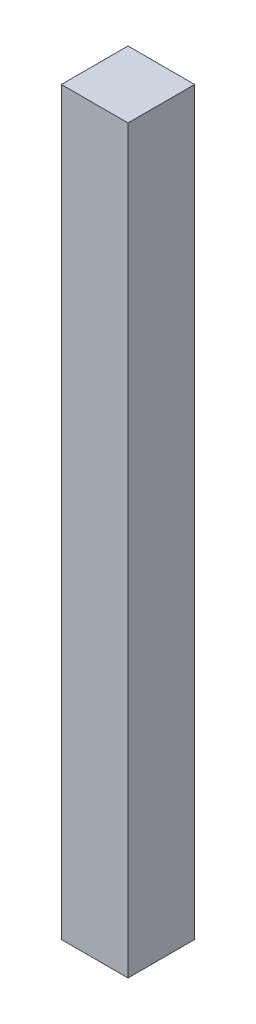
ISO-10303-21;
HEADER;
FILE_DESCRIPTION(('STEP AP214'),'2;1');
FILE_NAME('part.step','',(''),(''),'','','');
FILE_SCHEMA(('AUTOMOTIVE_DESIGN { 1 0 10303 214 1 1 1 1 }'));
ENDSEC;
DATA;
#1=APPLICATION_CONTEXT('core data for automotive mechanical design processes');
#2=APPLICATION_PROTOCOL_DEFINITION('international standard','automotive_design',2000,#1);
#3=PRODUCT_CONTEXT('',#1,'mechanical');
#4=PRODUCT('Part','Part','',(#3));
#5=PRODUCT_RELATED_PRODUCT_CATEGORY('part','',(#4));
#6=PRODUCT_DEFINITION_FORMATION('','',#4);
#7=PRODUCT_DEFINITION_CONTEXT('part definition',#1,'design');
#8=PRODUCT_DEFINITION('design','',#6,#7);
#9=PRODUCT_DEFINITION_SHAPE('','',#8);
#10=(LENGTH_UNIT() NAMED_UNIT(*) SI_UNIT(.MILLI.,.METRE.));
#11=(NAMED_UNIT(*) PLANE_ANGLE_UNIT() SI_UNIT($,.RADIAN.));
#12=(NAMED_UNIT(*) SI_UNIT($,.STERADIAN.) SOLID_ANGLE_UNIT());
#13=UNCERTAINTY_MEASURE_WITH_UNIT(LENGTH_MEASURE(1.E-05),#10,'distance_accuracy_value','');
#14=(GEOMETRIC_REPRESENTATION_CONTEXT(3) GLOBAL_UNCERTAINTY_ASSIGNED_CONTEXT((#13)) GLOBAL_UNIT_ASSIGNED_CONTEXT((#10,
#11,#12)) REPRESENTATION_CONTEXT('',''));
#15=CARTESIAN_POINT('',(0.,0.,0.));
#16=DIRECTION('',(0.,0.,1.));
#17=DIRECTION('',(1.,0.,0.));
#18=AXIS2_PLACEMENT_3D('',#15,#16,#17);
#19=CARTESIAN_POINT('',(637.,1590.,26.));
#20=DIRECTION('',(1.,0.,0.));
#21=DIRECTION('',(0.,0.,-1.));
#22=AXIS2_PLACEMENT_3D('',#19,#20,#21);
#23=PLANE('',#22);
#24=DIRECTION('',(0.,-1.,0.));
#25=VECTOR('',#24,1.);
#26=CARTESIAN_POINT('',(637.,1590.,8.));
#27=LINE('',#26,#25);
#28=CARTESIAN_POINT('',(637.,1790.,8.));
#29=VERTEX_POINT('',#28);
#30=CARTESIAN_POINT('',(637.,1590.,8.));
#31=VERTEX_POINT('',#30);
#32=EDGE_CURVE('E102',#29,#31,#27,.T.);
#33=ORIENTED_EDGE('',*,*,#32,.T.);
#34=DIRECTION('',(0.,0.,-1.));
#35=VECTOR('',#34,1.);
#36=CARTESIAN_POINT('',(637.,1590.,26.));
#37=LINE('',#36,#35);
#38=CARTESIAN_POINT('',(637.,1590.,26.));
#39=VERTEX_POINT('',#38);
#40=EDGE_CURVE('E11',#39,#31,#37,.T.);
#41=ORIENTED_EDGE('',*,*,#40,.F.);
#42=DIRECTION('',(0.,-1.,0.));
#43=VECTOR('',#42,1.);
#44=CARTESIAN_POINT('',(637.,1590.,26.));
#45=LINE('',#44,#43);
#46=CARTESIAN_POINT('',(637.,1790.,26.));
#47=VERTEX_POINT('',#46);
#48=EDGE_CURVE('E90',#47,#39,#45,.T.);
#49=ORIENTED_EDGE('',*,*,#48,.F.);
#50=DIRECTION('',(0.,0.,-1.));
#51=VECTOR('',#50,1.);
#52=CARTESIAN_POINT('',(637.,1790.,26.));
#53=LINE('',#52,#51);
#54=EDGE_CURVE('E98',#47,#29,#53,.T.);
#55=ORIENTED_EDGE('',*,*,#54,.T.);
#56=EDGE_LOOP('',(#33,#41,#49,#55));
#57=FACE_BOUND('',#56,.T.);
#58=ADVANCED_FACE('F39',(#57),#23,.F.);
#59=CARTESIAN_POINT('',(637.,1590.,26.));
#60=DIRECTION('',(0.,1.,0.));
#61=DIRECTION('',(0.,0.,1.));
#62=AXIS2_PLACEMENT_3D('',#59,#60,#61);
#63=PLANE('',#62);
#64=DIRECTION('',(1.,0.,0.));
#65=VECTOR('',#64,1.);
#66=CARTESIAN_POINT('',(637.,1590.,8.));
#67=LINE('',#66,#65);
#68=CARTESIAN_POINT('',(655.,1590.,8.));
#69=VERTEX_POINT('',#68);
#70=EDGE_CURVE('E94',#31,#69,#67,.T.);
#71=ORIENTED_EDGE('',*,*,#70,.T.);
#72=DIRECTION('',(0.,0.,-1.));
#73=VECTOR('',#72,1.);
#74=CARTESIAN_POINT('',(655.,1590.,26.));
#75=LINE('',#74,#73);
#76=CARTESIAN_POINT('',(655.,1590.,26.));
#77=VERTEX_POINT('',#76);
#78=EDGE_CURVE('E47',#77,#69,#75,.T.);
#79=ORIENTED_EDGE('',*,*,#78,.F.);
#80=DIRECTION('',(1.,0.,0.));
#81=VECTOR('',#80,1.);
#82=CARTESIAN_POINT('',(637.,1590.,26.));
#83=LINE('',#82,#81);
#84=EDGE_CURVE('E85',#39,#77,#83,.T.);
#85=ORIENTED_EDGE('',*,*,#84,.F.);
#86=ORIENTED_EDGE('',*,*,#40,.T.);
#87=EDGE_LOOP('',(#71,#79,#85,#86));
#88=FACE_BOUND('',#87,.T.);
#89=ADVANCED_FACE('F93',(#88),#63,.F.);
#90=CARTESIAN_POINT('',(655.,1590.,26.));
#91=DIRECTION('',(-1.,0.,0.));
#92=DIRECTION('',(0.,0.,1.));
#93=AXIS2_PLACEMENT_3D('',#90,#91,#92);
#94=PLANE('',#93);
#95=DIRECTION('',(0.,1.,0.));
#96=VECTOR('',#95,1.);
#97=CARTESIAN_POINT('',(655.,1590.,8.));
#98=LINE('',#97,#96);
#99=CARTESIAN_POINT('',(655.,1790.,8.));
#100=VERTEX_POINT('',#99);
#101=EDGE_CURVE('E72',#69,#100,#98,.T.);
#102=ORIENTED_EDGE('',*,*,#101,.T.);
#103=DIRECTION('',(0.,0.,-1.));
#104=VECTOR('',#103,1.);
#105=CARTESIAN_POINT('',(655.,1790.,26.));
#106=LINE('',#105,#104);
#107=CARTESIAN_POINT('',(655.,1790.,26.));
#108=VERTEX_POINT('',#107);
#109=EDGE_CURVE('E95',#108,#100,#106,.T.);
#110=ORIENTED_EDGE('',*,*,#109,.F.);
#111=DIRECTION('',(0.,1.,0.));
#112=VECTOR('',#111,1.);
#113=CARTESIAN_POINT('',(655.,1590.,26.));
#114=LINE('',#113,#112);
#115=EDGE_CURVE('E88',#77,#108,#114,.T.);
#116=ORIENTED_EDGE('',*,*,#115,.F.);
#117=ORIENTED_EDGE('',*,*,#78,.T.);
#118=EDGE_LOOP('',(#102,#110,#116,#117));
#119=FACE_BOUND('',#118,.T.);
#120=ADVANCED_FACE('F96',(#119),#94,.F.);
#121=CARTESIAN_POINT('',(637.,1790.,26.));
#122=DIRECTION('',(0.,-1.,0.));
#123=DIRECTION('',(0.,0.,-1.));
#124=AXIS2_PLACEMENT_3D('',#121,#122,#123);
#125=PLANE('',#124);
#126=DIRECTION('',(-1.,0.,0.));
#127=VECTOR('',#126,1.);
#128=CARTESIAN_POINT('',(637.,1790.,8.));
#129=LINE('',#128,#127);
#130=EDGE_CURVE('E78',#100,#29,#129,.T.);
#131=ORIENTED_EDGE('',*,*,#130,.T.);
#132=ORIENTED_EDGE('',*,*,#54,.F.);
#133=DIRECTION('',(-1.,0.,0.));
#134=VECTOR('',#133,1.);
#135=CARTESIAN_POINT('',(637.,1790.,26.));
#136=LINE('',#135,#134);
#137=EDGE_CURVE('E55',#108,#47,#136,.T.);
#138=ORIENTED_EDGE('',*,*,#137,.F.);
#139=ORIENTED_EDGE('',*,*,#109,.T.);
#140=EDGE_LOOP('',(#131,#132,#138,#139));
#141=FACE_BOUND('',#140,.T.);
#142=ADVANCED_FACE('F109',(#141),#125,.F.);
#143=CARTESIAN_POINT('',(0.,0.,26.));
#144=DIRECTION('',(0.,0.,-1.));
#145=DIRECTION('',(-1.,0.,0.));
#146=AXIS2_PLACEMENT_3D('',#143,#144,#145);
#147=PLANE('',#146);
#148=ORIENTED_EDGE('',*,*,#48,.T.);
#149=ORIENTED_EDGE('',*,*,#84,.T.);
#150=ORIENTED_EDGE('',*,*,#115,.T.);
#151=ORIENTED_EDGE('',*,*,#137,.T.);
#152=EDGE_LOOP('',(#148,#149,#150,#151));
#153=FACE_BOUND('',#152,.T.);
#154=ADVANCED_FACE('F86',(#153),#147,.F.);
#155=CARTESIAN_POINT('',(0.,0.,8.));
#156=DIRECTION('',(0.,0.,-1.));
#157=DIRECTION('',(-1.,0.,0.));
#158=AXIS2_PLACEMENT_3D('',#155,#156,#157);
#159=PLANE('',#158);
#160=ORIENTED_EDGE('',*,*,#32,.F.);
#161=ORIENTED_EDGE('',*,*,#130,.F.);
#162=ORIENTED_EDGE('',*,*,#101,.F.);
#163=ORIENTED_EDGE('',*,*,#70,.F.);
#164=EDGE_LOOP('',(#160,#161,#162,#163));
#165=FACE_BOUND('',#164,.T.);
#166=ADVANCED_FACE('F112',(#165),#159,.T.);
#167=CLOSED_SHELL('',(#58,#89,#120,#142,#154,#166));
#168=MANIFOLD_SOLID_BREP('B2',#167);
#169=ADVANCED_BREP_SHAPE_REPRESENTATION('',(#18,#168),#14);
#170=SHAPE_DEFINITION_REPRESENTATION(#9,#169);
ENDSEC;
END-ISO-10303-21;
